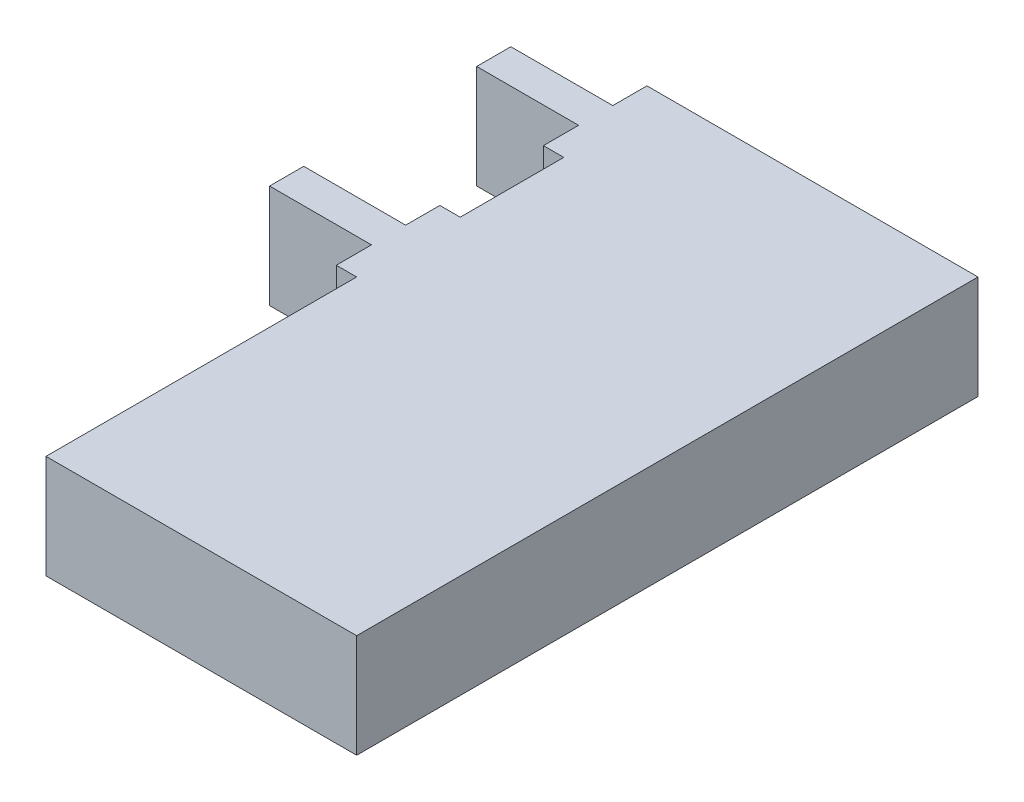
ISO-10303-21;
HEADER;
FILE_DESCRIPTION(('STEP AP214'),'2;1');
FILE_NAME('part.step','',(''),(''),'','','');
FILE_SCHEMA(('AUTOMOTIVE_DESIGN { 1 0 10303 214 1 1 1 1 }'));
ENDSEC;
DATA;
#1=APPLICATION_CONTEXT('core data for automotive mechanical design processes');
#2=APPLICATION_PROTOCOL_DEFINITION('international standard','automotive_design',2000,#1);
#3=PRODUCT_CONTEXT('',#1,'mechanical');
#4=PRODUCT('Part','Part','',(#3));
#5=PRODUCT_RELATED_PRODUCT_CATEGORY('part','',(#4));
#6=PRODUCT_DEFINITION_FORMATION('','',#4);
#7=PRODUCT_DEFINITION_CONTEXT('part definition',#1,'design');
#8=PRODUCT_DEFINITION('design','',#6,#7);
#9=PRODUCT_DEFINITION_SHAPE('','',#8);
#10=(LENGTH_UNIT() NAMED_UNIT(*) SI_UNIT(.MILLI.,.METRE.));
#11=(NAMED_UNIT(*) PLANE_ANGLE_UNIT() SI_UNIT($,.RADIAN.));
#12=(NAMED_UNIT(*) SI_UNIT($,.STERADIAN.) SOLID_ANGLE_UNIT());
#13=UNCERTAINTY_MEASURE_WITH_UNIT(LENGTH_MEASURE(1.E-05),#10,'distance_accuracy_value','');
#14=(GEOMETRIC_REPRESENTATION_CONTEXT(3) GLOBAL_UNCERTAINTY_ASSIGNED_CONTEXT((#13)) GLOBAL_UNIT_ASSIGNED_CONTEXT((#10,
#11,#12)) REPRESENTATION_CONTEXT('',''));
#15=CARTESIAN_POINT('',(0.,0.,0.));
#16=DIRECTION('',(0.,0.,1.));
#17=DIRECTION('',(1.,0.,0.));
#18=AXIS2_PLACEMENT_3D('',#15,#16,#17);
#19=CARTESIAN_POINT('',(-43.1,0.,-25.4));
#20=DIRECTION('',(-1.,0.,0.));
#21=DIRECTION('',(0.,0.,1.));
#22=AXIS2_PLACEMENT_3D('',#19,#20,#21);
#23=PLANE('',#22);
#24=DIRECTION('',(0.,0.,1.));
#25=VECTOR('',#24,1.);
#26=CARTESIAN_POINT('',(-43.1,0.,-25.4));
#27=LINE('',#26,#25);
#28=CARTESIAN_POINT('',(-43.1,0.,-25.4));
#29=VERTEX_POINT('',#28);
#30=CARTESIAN_POINT('',(-43.1,0.,-17.018));
#31=VERTEX_POINT('',#30);
#32=EDGE_CURVE('E195',#29,#31,#27,.T.);
#33=ORIENTED_EDGE('',*,*,#32,.T.);
#34=DIRECTION('',(0.,-1.,0.));
#35=VECTOR('',#34,1.);
#36=CARTESIAN_POINT('',(-43.1,25.4,-17.018));
#37=LINE('',#36,#35);
#38=CARTESIAN_POINT('',(-43.1,25.4,-17.018));
#39=VERTEX_POINT('',#38);
#40=EDGE_CURVE('E181',#39,#31,#37,.T.);
#41=ORIENTED_EDGE('',*,*,#40,.F.);
#42=DIRECTION('',(0.,0.,-1.));
#43=VECTOR('',#42,1.);
#44=CARTESIAN_POINT('',(-43.1,25.4,-25.4));
#45=LINE('',#44,#43);
#46=CARTESIAN_POINT('',(-43.1,25.4,-25.4));
#47=VERTEX_POINT('',#46);
#48=EDGE_CURVE('E199',#39,#47,#45,.T.);
#49=ORIENTED_EDGE('',*,*,#48,.T.);
#50=DIRECTION('',(0.,-1.,0.));
#51=VECTOR('',#50,1.);
#52=CARTESIAN_POINT('',(-43.1,25.4,-25.4));
#53=LINE('',#52,#51);
#54=EDGE_CURVE('E191',#47,#29,#53,.T.);
#55=ORIENTED_EDGE('',*,*,#54,.T.);
#56=EDGE_LOOP('',(#33,#41,#49,#55));
#57=FACE_BOUND('',#56,.T.);
#58=ADVANCED_FACE('F31',(#57),#23,.T.);
#59=CARTESIAN_POINT('',(-43.1,25.4,0.));
#60=VERTEX_POINT('',#59);
#61=CARTESIAN_POINT('',(-43.1,25.4,-8.636));
#62=VERTEX_POINT('',#61);
#63=EDGE_CURVE('E49',#60,#62,#45,.T.);
#64=ORIENTED_EDGE('',*,*,#63,.T.);
#65=DIRECTION('',(0.,1.,0.));
#66=VECTOR('',#65,1.);
#67=CARTESIAN_POINT('',(-43.1,25.4,-8.636));
#68=LINE('',#67,#66);
#69=CARTESIAN_POINT('',(-43.1,0.,-8.63599999999999));
#70=VERTEX_POINT('',#69);
#71=EDGE_CURVE('E53',#70,#62,#68,.T.);
#72=ORIENTED_EDGE('',*,*,#71,.F.);
#73=CARTESIAN_POINT('',(-43.1,0.,0.));
#74=VERTEX_POINT('',#73);
#75=EDGE_CURVE('E194',#70,#74,#27,.T.);
#76=ORIENTED_EDGE('',*,*,#75,.T.);
#77=DIRECTION('',(0.,1.,0.));
#78=VECTOR('',#77,1.);
#79=CARTESIAN_POINT('',(-43.1,25.4,0.));
#80=LINE('',#79,#78);
#81=EDGE_CURVE('E197',#74,#60,#80,.T.);
#82=ORIENTED_EDGE('',*,*,#81,.T.);
#83=EDGE_LOOP('',(#64,#72,#76,#82));
#84=FACE_BOUND('',#83,.T.);
#85=ADVANCED_FACE('F389',(#84),#23,.T.);
#86=CARTESIAN_POINT('',(-38.1,25.4,76.2));
#87=DIRECTION('',(1.,0.,0.));
#88=DIRECTION('',(0.,0.,-1.));
#89=AXIS2_PLACEMENT_3D('',#86,#87,#88);
#90=PLANE('',#89);
#91=DIRECTION('',(0.,-1.,0.));
#92=VECTOR('',#91,1.);
#93=CARTESIAN_POINT('',(-38.1,25.4,-25.4));
#94=LINE('',#93,#92);
#95=CARTESIAN_POINT('',(-38.1,25.4,-25.4));
#96=VERTEX_POINT('',#95);
#97=CARTESIAN_POINT('',(-38.1,0.,-25.4));
#98=VERTEX_POINT('',#97);
#99=EDGE_CURVE('E182',#96,#98,#94,.T.);
#100=ORIENTED_EDGE('',*,*,#99,.F.);
#101=DIRECTION('',(0.,0.,1.));
#102=VECTOR('',#101,1.);
#103=CARTESIAN_POINT('',(-38.1,25.4,76.2));
#104=LINE('',#103,#102);
#105=CARTESIAN_POINT('',(-38.1,25.4,-50.8));
#106=VERTEX_POINT('',#105);
#107=EDGE_CURVE('E255',#106,#96,#104,.T.);
#108=ORIENTED_EDGE('',*,*,#107,.F.);
#109=DIRECTION('',(0.,1.,0.));
#110=VECTOR('',#109,1.);
#111=CARTESIAN_POINT('',(-38.1,25.4,-50.8));
#112=LINE('',#111,#110);
#113=CARTESIAN_POINT('',(-38.1,0.,-50.7999999999999));
#114=VERTEX_POINT('',#113);
#115=EDGE_CURVE('E259',#114,#106,#112,.T.);
#116=ORIENTED_EDGE('',*,*,#115,.F.);
#117=DIRECTION('',(0.,0.,1.));
#118=VECTOR('',#117,1.);
#119=CARTESIAN_POINT('',(-38.1,0.,76.2));
#120=LINE('',#119,#118);
#121=EDGE_CURVE('E243',#114,#98,#120,.T.);
#122=ORIENTED_EDGE('',*,*,#121,.T.);
#123=EDGE_LOOP('',(#100,#108,#116,#122));
#124=FACE_BOUND('',#123,.T.);
#125=ADVANCED_FACE('F394',(#124),#90,.F.);
#126=DIRECTION('',(0.,1.,0.));
#127=VECTOR('',#126,1.);
#128=CARTESIAN_POINT('',(-38.1,25.4,0.));
#129=LINE('',#128,#127);
#130=CARTESIAN_POINT('',(-38.1,0.,0.));
#131=VERTEX_POINT('',#130);
#132=CARTESIAN_POINT('',(-38.1,25.4,0.));
#133=VERTEX_POINT('',#132);
#134=EDGE_CURVE('E185',#131,#133,#129,.T.);
#135=ORIENTED_EDGE('',*,*,#134,.F.);
#136=CARTESIAN_POINT('',(-38.1,0.,76.2));
#137=VERTEX_POINT('',#136);
#138=EDGE_CURVE('E241',#131,#137,#120,.T.);
#139=ORIENTED_EDGE('',*,*,#138,.T.);
#140=DIRECTION('',(0.,-1.,0.));
#141=VECTOR('',#140,1.);
#142=CARTESIAN_POINT('',(-38.1,25.4,76.2));
#143=LINE('',#142,#141);
#144=CARTESIAN_POINT('',(-38.1,25.4,76.2));
#145=VERTEX_POINT('',#144);
#146=EDGE_CURVE('E41',#145,#137,#143,.T.);
#147=ORIENTED_EDGE('',*,*,#146,.F.);
#148=EDGE_CURVE('E35',#133,#145,#104,.T.);
#149=ORIENTED_EDGE('',*,*,#148,.F.);
#150=EDGE_LOOP('',(#135,#139,#147,#149));
#151=FACE_BOUND('',#150,.T.);
#152=ADVANCED_FACE('F375',(#151),#90,.F.);
#153=CARTESIAN_POINT('',(-43.1,0.,-76.2));
#154=DIRECTION('',(-1.,0.,0.));
#155=DIRECTION('',(0.,0.,1.));
#156=AXIS2_PLACEMENT_3D('',#153,#154,#155);
#157=PLANE('',#156);
#158=DIRECTION('',(0.,-1.,0.));
#159=VECTOR('',#158,1.);
#160=CARTESIAN_POINT('',(-43.1,25.4,-67.818));
#161=LINE('',#160,#159);
#162=CARTESIAN_POINT('',(-43.1,25.4,-67.818));
#163=VERTEX_POINT('',#162);
#164=CARTESIAN_POINT('',(-43.1,0.,-67.818));
#165=VERTEX_POINT('',#164);
#166=EDGE_CURVE('E215',#163,#165,#161,.T.);
#167=ORIENTED_EDGE('',*,*,#166,.F.);
#168=DIRECTION('',(0.,0.,-1.));
#169=VECTOR('',#168,1.);
#170=CARTESIAN_POINT('',(-43.1,25.4,-76.2));
#171=LINE('',#170,#169);
#172=CARTESIAN_POINT('',(-43.1,25.4,-76.2));
#173=VERTEX_POINT('',#172);
#174=EDGE_CURVE('E300',#163,#173,#171,.T.);
#175=ORIENTED_EDGE('',*,*,#174,.T.);
#176=DIRECTION('',(0.,-1.,0.));
#177=VECTOR('',#176,1.);
#178=CARTESIAN_POINT('',(-43.1,25.4,-76.2));
#179=LINE('',#178,#177);
#180=CARTESIAN_POINT('',(-43.1,0.,-76.2));
#181=VERTEX_POINT('',#180);
#182=EDGE_CURVE('E297',#173,#181,#179,.T.);
#183=ORIENTED_EDGE('',*,*,#182,.T.);
#184=DIRECTION('',(0.,0.,1.));
#185=VECTOR('',#184,1.);
#186=CARTESIAN_POINT('',(-43.1,0.,-76.2));
#187=LINE('',#186,#185);
#188=EDGE_CURVE('E289',#181,#165,#187,.T.);
#189=ORIENTED_EDGE('',*,*,#188,.T.);
#190=EDGE_LOOP('',(#167,#175,#183,#189));
#191=FACE_BOUND('',#190,.T.);
#192=ADVANCED_FACE('F313',(#191),#157,.T.);
#193=CARTESIAN_POINT('',(38.1,25.4,76.2));
#194=DIRECTION('',(-1.,0.,0.));
#195=DIRECTION('',(0.,0.,1.));
#196=AXIS2_PLACEMENT_3D('',#193,#194,#195);
#197=PLANE('',#196);
#198=DIRECTION('',(0.,0.,-1.));
#199=VECTOR('',#198,1.);
#200=CARTESIAN_POINT('',(38.1,0.,76.2));
#201=LINE('',#200,#199);
#202=CARTESIAN_POINT('',(38.1,0.,76.2));
#203=VERTEX_POINT('',#202);
#204=CARTESIAN_POINT('',(38.1,0.,-76.2));
#205=VERTEX_POINT('',#204);
#206=EDGE_CURVE('E269',#203,#205,#201,.T.);
#207=ORIENTED_EDGE('',*,*,#206,.T.);
#208=DIRECTION('',(0.,-1.,0.));
#209=VECTOR('',#208,1.);
#210=CARTESIAN_POINT('',(38.1,25.4,-76.2));
#211=LINE('',#210,#209);
#212=CARTESIAN_POINT('',(38.1,25.4,-76.2));
#213=VERTEX_POINT('',#212);
#214=EDGE_CURVE('E11',#213,#205,#211,.T.);
#215=ORIENTED_EDGE('',*,*,#214,.F.);
#216=DIRECTION('',(0.,0.,-1.));
#217=VECTOR('',#216,1.);
#218=CARTESIAN_POINT('',(38.1,25.4,76.2));
#219=LINE('',#218,#217);
#220=CARTESIAN_POINT('',(38.1,25.4,76.2));
#221=VERTEX_POINT('',#220);
#222=EDGE_CURVE('E320',#221,#213,#219,.T.);
#223=ORIENTED_EDGE('',*,*,#222,.F.);
#224=DIRECTION('',(0.,-1.,0.));
#225=VECTOR('',#224,1.);
#226=CARTESIAN_POINT('',(38.1,25.4,76.2));
#227=LINE('',#226,#225);
#228=EDGE_CURVE('E268',#221,#203,#227,.T.);
#229=ORIENTED_EDGE('',*,*,#228,.T.);
#230=EDGE_LOOP('',(#207,#215,#223,#229));
#231=FACE_BOUND('',#230,.T.);
#232=ADVANCED_FACE('F33',(#231),#197,.F.);
#233=CARTESIAN_POINT('',(-38.1,25.4,-76.2));
#234=DIRECTION('',(0.,0.,1.));
#235=DIRECTION('',(1.,0.,0.));
#236=AXIS2_PLACEMENT_3D('',#233,#234,#235);
#237=PLANE('',#236);
#238=DIRECTION('',(-1.,0.,0.));
#239=VECTOR('',#238,1.);
#240=CARTESIAN_POINT('',(-38.1,0.,-76.2));
#241=LINE('',#240,#239);
#242=EDGE_CURVE('E244',#205,#181,#241,.T.);
#243=ORIENTED_EDGE('',*,*,#242,.T.);
#244=ORIENTED_EDGE('',*,*,#182,.F.);
#245=DIRECTION('',(-1.,0.,0.));
#246=VECTOR('',#245,1.);
#247=CARTESIAN_POINT('',(-38.1,25.4,-76.2));
#248=LINE('',#247,#246);
#249=EDGE_CURVE('E265',#213,#173,#248,.T.);
#250=ORIENTED_EDGE('',*,*,#249,.F.);
#251=ORIENTED_EDGE('',*,*,#214,.T.);
#252=EDGE_LOOP('',(#243,#244,#250,#251));
#253=FACE_BOUND('',#252,.T.);
#254=ADVANCED_FACE('F322',(#253),#237,.F.);
#255=CARTESIAN_POINT('',(-38.1,25.4,76.2));
#256=DIRECTION('',(0.,0.,-1.));
#257=DIRECTION('',(-1.,0.,0.));
#258=AXIS2_PLACEMENT_3D('',#255,#256,#257);
#259=PLANE('',#258);
#260=DIRECTION('',(1.,0.,0.));
#261=VECTOR('',#260,1.);
#262=CARTESIAN_POINT('',(-38.1,0.,76.2));
#263=LINE('',#262,#261);
#264=EDGE_CURVE('E249',#137,#203,#263,.T.);
#265=ORIENTED_EDGE('',*,*,#264,.T.);
#266=ORIENTED_EDGE('',*,*,#228,.F.);
#267=DIRECTION('',(1.,0.,0.));
#268=VECTOR('',#267,1.);
#269=CARTESIAN_POINT('',(-38.1,25.4,76.2));
#270=LINE('',#269,#268);
#271=EDGE_CURVE('E258',#145,#221,#270,.T.);
#272=ORIENTED_EDGE('',*,*,#271,.F.);
#273=ORIENTED_EDGE('',*,*,#146,.T.);
#274=EDGE_LOOP('',(#265,#266,#272,#273));
#275=FACE_BOUND('',#274,.T.);
#276=ADVANCED_FACE('F381',(#275),#259,.F.);
#277=CARTESIAN_POINT('',(38.1,25.4,-76.2));
#278=DIRECTION('',(0.,-1.,0.));
#279=DIRECTION('',(0.,0.,-1.));
#280=AXIS2_PLACEMENT_3D('',#277,#278,#279);
#281=PLANE('',#280);
#282=ORIENTED_EDGE('',*,*,#222,.T.);
#283=ORIENTED_EDGE('',*,*,#249,.T.);
#284=ORIENTED_EDGE('',*,*,#174,.F.);
#285=DIRECTION('',(1.,0.,0.));
#286=VECTOR('',#285,1.);
#287=CARTESIAN_POINT('',(-68.1,25.4,-67.818));
#288=LINE('',#287,#286);
#289=CARTESIAN_POINT('',(-68.1,25.4,-67.818));
#290=VERTEX_POINT('',#289);
#291=EDGE_CURVE('E226',#290,#163,#288,.T.);
#292=ORIENTED_EDGE('',*,*,#291,.F.);
#293=DIRECTION('',(0.,0.,-1.));
#294=VECTOR('',#293,1.);
#295=CARTESIAN_POINT('',(-68.1,25.4,-67.818));
#296=LINE('',#295,#294);
#297=CARTESIAN_POINT('',(-68.1,25.4,-59.436));
#298=VERTEX_POINT('',#297);
#299=EDGE_CURVE('E224',#298,#290,#296,.T.);
#300=ORIENTED_EDGE('',*,*,#299,.F.);
#301=DIRECTION('',(1.,0.,0.));
#302=VECTOR('',#301,1.);
#303=CARTESIAN_POINT('',(-68.1,25.4,-59.436));
#304=LINE('',#303,#302);
#305=CARTESIAN_POINT('',(-43.1,25.4,-59.436));
#306=VERTEX_POINT('',#305);
#307=EDGE_CURVE('E239',#298,#306,#304,.T.);
#308=ORIENTED_EDGE('',*,*,#307,.T.);
#309=CARTESIAN_POINT('',(-43.1,25.4,-50.8));
#310=VERTEX_POINT('',#309);
#311=EDGE_CURVE('E283',#310,#306,#171,.T.);
#312=ORIENTED_EDGE('',*,*,#311,.F.);
#313=DIRECTION('',(1.,0.,0.));
#314=VECTOR('',#313,1.);
#315=CARTESIAN_POINT('',(-43.1,25.4,-50.8));
#316=LINE('',#315,#314);
#317=EDGE_CURVE('E276',#310,#106,#316,.T.);
#318=ORIENTED_EDGE('',*,*,#317,.T.);
#319=ORIENTED_EDGE('',*,*,#107,.T.);
#320=DIRECTION('',(1.,0.,0.));
#321=VECTOR('',#320,1.);
#322=CARTESIAN_POINT('',(-43.1,25.4,-25.4));
#323=LINE('',#322,#321);
#324=EDGE_CURVE('E200',#47,#96,#323,.T.);
#325=ORIENTED_EDGE('',*,*,#324,.F.);
#326=ORIENTED_EDGE('',*,*,#48,.F.);
#327=DIRECTION('',(1.,0.,0.));
#328=VECTOR('',#327,1.);
#329=CARTESIAN_POINT('',(-68.1,25.4,-17.018));
#330=LINE('',#329,#328);
#331=CARTESIAN_POINT('',(-68.1,25.4,-17.018));
#332=VERTEX_POINT('',#331);
#333=EDGE_CURVE('E357',#332,#39,#330,.T.);
#334=ORIENTED_EDGE('',*,*,#333,.F.);
#335=DIRECTION('',(0.,0.,-1.));
#336=VECTOR('',#335,1.);
#337=CARTESIAN_POINT('',(-68.1,25.4,-17.018));
#338=LINE('',#337,#336);
#339=CARTESIAN_POINT('',(-68.1,25.4,-8.636));
#340=VERTEX_POINT('',#339);
#341=EDGE_CURVE('E174',#340,#332,#338,.T.);
#342=ORIENTED_EDGE('',*,*,#341,.F.);
#343=DIRECTION('',(1.,0.,0.));
#344=VECTOR('',#343,1.);
#345=CARTESIAN_POINT('',(-68.1,25.4,-8.636));
#346=LINE('',#345,#344);
#347=EDGE_CURVE('E187',#340,#62,#346,.T.);
#348=ORIENTED_EDGE('',*,*,#347,.T.);
#349=ORIENTED_EDGE('',*,*,#63,.F.);
#350=DIRECTION('',(1.,0.,0.));
#351=VECTOR('',#350,1.);
#352=CARTESIAN_POINT('',(-43.1,25.4,0.));
#353=LINE('',#352,#351);
#354=EDGE_CURVE('E206',#60,#133,#353,.T.);
#355=ORIENTED_EDGE('',*,*,#354,.T.);
#356=ORIENTED_EDGE('',*,*,#148,.T.);
#357=ORIENTED_EDGE('',*,*,#271,.T.);
#358=EDGE_LOOP('',(#282,#283,#284,#292,#300,#308,#312,#318,#319,#325,#326,#334,#342,#348,#349,
#355,#356,#357));
#359=FACE_BOUND('',#358,.T.);
#360=ADVANCED_FACE('F318',(#359),#281,.F.);
#361=CARTESIAN_POINT('',(38.1,0.,-76.2));
#362=DIRECTION('',(0.,-1.,0.));
#363=DIRECTION('',(0.,0.,-1.));
#364=AXIS2_PLACEMENT_3D('',#361,#362,#363);
#365=PLANE('',#364);
#366=ORIENTED_EDGE('',*,*,#206,.F.);
#367=ORIENTED_EDGE('',*,*,#264,.F.);
#368=ORIENTED_EDGE('',*,*,#138,.F.);
#369=DIRECTION('',(1.,0.,0.));
#370=VECTOR('',#369,1.);
#371=CARTESIAN_POINT('',(-43.1,0.,0.));
#372=LINE('',#371,#370);
#373=EDGE_CURVE('E209',#74,#131,#372,.T.);
#374=ORIENTED_EDGE('',*,*,#373,.F.);
#375=ORIENTED_EDGE('',*,*,#75,.F.);
#376=DIRECTION('',(1.,0.,0.));
#377=VECTOR('',#376,1.);
#378=CARTESIAN_POINT('',(-68.1,0.,-8.63599999999999));
#379=LINE('',#378,#377);
#380=CARTESIAN_POINT('',(-68.1,0.,-8.63599999999999));
#381=VERTEX_POINT('',#380);
#382=EDGE_CURVE('E165',#381,#70,#379,.T.);
#383=ORIENTED_EDGE('',*,*,#382,.F.);
#384=DIRECTION('',(0.,0.,1.));
#385=VECTOR('',#384,1.);
#386=CARTESIAN_POINT('',(-68.1,0.,-17.018));
#387=LINE('',#386,#385);
#388=CARTESIAN_POINT('',(-68.1,0.,-17.018));
#389=VERTEX_POINT('',#388);
#390=EDGE_CURVE('E157',#389,#381,#387,.T.);
#391=ORIENTED_EDGE('',*,*,#390,.F.);
#392=DIRECTION('',(1.,0.,0.));
#393=VECTOR('',#392,1.);
#394=CARTESIAN_POINT('',(-68.1,0.,-17.018));
#395=LINE('',#394,#393);
#396=EDGE_CURVE('E162',#389,#31,#395,.T.);
#397=ORIENTED_EDGE('',*,*,#396,.T.);
#398=ORIENTED_EDGE('',*,*,#32,.F.);
#399=DIRECTION('',(1.,0.,0.));
#400=VECTOR('',#399,1.);
#401=CARTESIAN_POINT('',(-43.1,0.,-25.4));
#402=LINE('',#401,#400);
#403=EDGE_CURVE('E212',#29,#98,#402,.T.);
#404=ORIENTED_EDGE('',*,*,#403,.T.);
#405=ORIENTED_EDGE('',*,*,#121,.F.);
#406=DIRECTION('',(1.,0.,0.));
#407=VECTOR('',#406,1.);
#408=CARTESIAN_POINT('',(-43.1,0.,-50.8));
#409=LINE('',#408,#407);
#410=CARTESIAN_POINT('',(-43.1,0.,-50.8));
#411=VERTEX_POINT('',#410);
#412=EDGE_CURVE('E271',#411,#114,#409,.T.);
#413=ORIENTED_EDGE('',*,*,#412,.F.);
#414=CARTESIAN_POINT('',(-43.1,0.,-59.436));
#415=VERTEX_POINT('',#414);
#416=EDGE_CURVE('E293',#415,#411,#187,.T.);
#417=ORIENTED_EDGE('',*,*,#416,.F.);
#418=DIRECTION('',(1.,0.,0.));
#419=VECTOR('',#418,1.);
#420=CARTESIAN_POINT('',(-68.1,0.,-59.436));
#421=LINE('',#420,#419);
#422=CARTESIAN_POINT('',(-68.1,0.,-59.436));
#423=VERTEX_POINT('',#422);
#424=EDGE_CURVE('E327',#423,#415,#421,.T.);
#425=ORIENTED_EDGE('',*,*,#424,.F.);
#426=DIRECTION('',(0.,0.,1.));
#427=VECTOR('',#426,1.);
#428=CARTESIAN_POINT('',(-68.1,0.,-67.818));
#429=LINE('',#428,#427);
#430=CARTESIAN_POINT('',(-68.1,0.,-67.818));
#431=VERTEX_POINT('',#430);
#432=EDGE_CURVE('E219',#431,#423,#429,.T.);
#433=ORIENTED_EDGE('',*,*,#432,.F.);
#434=DIRECTION('',(1.,0.,0.));
#435=VECTOR('',#434,1.);
#436=CARTESIAN_POINT('',(-68.1,0.,-67.818));
#437=LINE('',#436,#435);
#438=EDGE_CURVE('E324',#431,#165,#437,.T.);
#439=ORIENTED_EDGE('',*,*,#438,.T.);
#440=ORIENTED_EDGE('',*,*,#188,.F.);
#441=ORIENTED_EDGE('',*,*,#242,.F.);
#442=EDGE_LOOP('',(#366,#367,#368,#374,#375,#383,#391,#397,#398,#404,#405,#413,#417,#425,#433,
#439,#440,#441));
#443=FACE_BOUND('',#442,.T.);
#444=ADVANCED_FACE('F160',(#443),#365,.T.);
#445=CARTESIAN_POINT('',(-43.1,25.4,-50.8));
#446=DIRECTION('',(0.,0.,-1.));
#447=DIRECTION('',(0.,1.,0.));
#448=AXIS2_PLACEMENT_3D('',#445,#446,#447);
#449=PLANE('',#448);
#450=ORIENTED_EDGE('',*,*,#115,.T.);
#451=ORIENTED_EDGE('',*,*,#317,.F.);
#452=DIRECTION('',(0.,1.,0.));
#453=VECTOR('',#452,1.);
#454=CARTESIAN_POINT('',(-43.1,25.4,-50.8));
#455=LINE('',#454,#453);
#456=EDGE_CURVE('E292',#411,#310,#455,.T.);
#457=ORIENTED_EDGE('',*,*,#456,.F.);
#458=ORIENTED_EDGE('',*,*,#412,.T.);
#459=EDGE_LOOP('',(#450,#451,#457,#458));
#460=FACE_BOUND('',#459,.T.);
#461=ADVANCED_FACE('F349',(#460),#449,.F.);
#462=DIRECTION('',(0.,1.,0.));
#463=VECTOR('',#462,1.);
#464=CARTESIAN_POINT('',(-43.1,25.4,-59.436));
#465=LINE('',#464,#463);
#466=EDGE_CURVE('E220',#415,#306,#465,.T.);
#467=ORIENTED_EDGE('',*,*,#466,.F.);
#468=ORIENTED_EDGE('',*,*,#416,.T.);
#469=ORIENTED_EDGE('',*,*,#456,.T.);
#470=ORIENTED_EDGE('',*,*,#311,.T.);
#471=EDGE_LOOP('',(#467,#468,#469,#470));
#472=FACE_BOUND('',#471,.T.);
#473=ADVANCED_FACE('F348',(#472),#157,.T.);
#474=CARTESIAN_POINT('',(-68.1,25.4,-67.818));
#475=DIRECTION('',(0.,0.,1.));
#476=DIRECTION('',(1.,0.,0.));
#477=AXIS2_PLACEMENT_3D('',#474,#475,#476);
#478=PLANE('',#477);
#479=ORIENTED_EDGE('',*,*,#166,.T.);
#480=ORIENTED_EDGE('',*,*,#438,.F.);
#481=DIRECTION('',(0.,-1.,0.));
#482=VECTOR('',#481,1.);
#483=CARTESIAN_POINT('',(-68.1,25.4,-67.818));
#484=LINE('',#483,#482);
#485=EDGE_CURVE('E216',#290,#431,#484,.T.);
#486=ORIENTED_EDGE('',*,*,#485,.F.);
#487=ORIENTED_EDGE('',*,*,#291,.T.);
#488=EDGE_LOOP('',(#479,#480,#486,#487));
#489=FACE_BOUND('',#488,.T.);
#490=ADVANCED_FACE('F406',(#489),#478,.F.);
#491=CARTESIAN_POINT('',(-68.1,25.4,-59.436));
#492=DIRECTION('',(0.,0.,-1.));
#493=DIRECTION('',(-1.,0.,0.));
#494=AXIS2_PLACEMENT_3D('',#491,#492,#493);
#495=PLANE('',#494);
#496=ORIENTED_EDGE('',*,*,#466,.T.);
#497=ORIENTED_EDGE('',*,*,#307,.F.);
#498=DIRECTION('',(0.,1.,0.));
#499=VECTOR('',#498,1.);
#500=CARTESIAN_POINT('',(-68.1,25.4,-59.436));
#501=LINE('',#500,#499);
#502=EDGE_CURVE('E222',#423,#298,#501,.T.);
#503=ORIENTED_EDGE('',*,*,#502,.F.);
#504=ORIENTED_EDGE('',*,*,#424,.T.);
#505=EDGE_LOOP('',(#496,#497,#503,#504));
#506=FACE_BOUND('',#505,.T.);
#507=ADVANCED_FACE('F339',(#506),#495,.F.);
#508=CARTESIAN_POINT('',(-68.1,0.,-67.818));
#509=DIRECTION('',(-1.,0.,0.));
#510=DIRECTION('',(0.,0.,1.));
#511=AXIS2_PLACEMENT_3D('',#508,#509,#510);
#512=PLANE('',#511);
#513=ORIENTED_EDGE('',*,*,#485,.T.);
#514=ORIENTED_EDGE('',*,*,#432,.T.);
#515=ORIENTED_EDGE('',*,*,#502,.T.);
#516=ORIENTED_EDGE('',*,*,#299,.T.);
#517=EDGE_LOOP('',(#513,#514,#515,#516));
#518=FACE_BOUND('',#517,.T.);
#519=ADVANCED_FACE('F346',(#518),#512,.T.);
#520=CARTESIAN_POINT('',(-43.1,25.4,-25.4));
#521=DIRECTION('',(0.,0.,1.));
#522=DIRECTION('',(0.,-1.,0.));
#523=AXIS2_PLACEMENT_3D('',#520,#521,#522);
#524=PLANE('',#523);
#525=ORIENTED_EDGE('',*,*,#99,.T.);
#526=ORIENTED_EDGE('',*,*,#403,.F.);
#527=ORIENTED_EDGE('',*,*,#54,.F.);
#528=ORIENTED_EDGE('',*,*,#324,.T.);
#529=EDGE_LOOP('',(#525,#526,#527,#528));
#530=FACE_BOUND('',#529,.T.);
#531=ADVANCED_FACE('F354',(#530),#524,.F.);
#532=CARTESIAN_POINT('',(-43.1,25.4,0.));
#533=DIRECTION('',(0.,0.,-1.));
#534=DIRECTION('',(-1.,0.,0.));
#535=AXIS2_PLACEMENT_3D('',#532,#533,#534);
#536=PLANE('',#535);
#537=ORIENTED_EDGE('',*,*,#134,.T.);
#538=ORIENTED_EDGE('',*,*,#354,.F.);
#539=ORIENTED_EDGE('',*,*,#81,.F.);
#540=ORIENTED_EDGE('',*,*,#373,.T.);
#541=EDGE_LOOP('',(#537,#538,#539,#540));
#542=FACE_BOUND('',#541,.T.);
#543=ADVANCED_FACE('F371',(#542),#536,.F.);
#544=CARTESIAN_POINT('',(-68.1,25.4,-17.018));
#545=DIRECTION('',(0.,0.,1.));
#546=DIRECTION('',(0.,-1.,0.));
#547=AXIS2_PLACEMENT_3D('',#544,#545,#546);
#548=PLANE('',#547);
#549=ORIENTED_EDGE('',*,*,#40,.T.);
#550=ORIENTED_EDGE('',*,*,#396,.F.);
#551=DIRECTION('',(0.,-1.,0.));
#552=VECTOR('',#551,1.);
#553=CARTESIAN_POINT('',(-68.1,25.4,-17.018));
#554=LINE('',#553,#552);
#555=EDGE_CURVE('E169',#332,#389,#554,.T.);
#556=ORIENTED_EDGE('',*,*,#555,.F.);
#557=ORIENTED_EDGE('',*,*,#333,.T.);
#558=EDGE_LOOP('',(#549,#550,#556,#557));
#559=FACE_BOUND('',#558,.T.);
#560=ADVANCED_FACE('F179',(#559),#548,.F.);
#561=CARTESIAN_POINT('',(-68.1,25.4,-8.636));
#562=DIRECTION('',(0.,0.,-1.));
#563=DIRECTION('',(0.,1.,0.));
#564=AXIS2_PLACEMENT_3D('',#561,#562,#563);
#565=PLANE('',#564);
#566=ORIENTED_EDGE('',*,*,#71,.T.);
#567=ORIENTED_EDGE('',*,*,#347,.F.);
#568=DIRECTION('',(0.,1.,0.));
#569=VECTOR('',#568,1.);
#570=CARTESIAN_POINT('',(-68.1,25.4,-8.636));
#571=LINE('',#570,#569);
#572=EDGE_CURVE('E168',#381,#340,#571,.T.);
#573=ORIENTED_EDGE('',*,*,#572,.F.);
#574=ORIENTED_EDGE('',*,*,#382,.T.);
#575=EDGE_LOOP('',(#566,#567,#573,#574));
#576=FACE_BOUND('',#575,.T.);
#577=ADVANCED_FACE('F366',(#576),#565,.F.);
#578=CARTESIAN_POINT('',(-68.1,0.,-17.018));
#579=DIRECTION('',(-1.,0.,0.));
#580=DIRECTION('',(0.,0.,1.));
#581=AXIS2_PLACEMENT_3D('',#578,#579,#580);
#582=PLANE('',#581);
#583=ORIENTED_EDGE('',*,*,#555,.T.);
#584=ORIENTED_EDGE('',*,*,#390,.T.);
#585=ORIENTED_EDGE('',*,*,#572,.T.);
#586=ORIENTED_EDGE('',*,*,#341,.T.);
#587=EDGE_LOOP('',(#583,#584,#585,#586));
#588=FACE_BOUND('',#587,.T.);
#589=ADVANCED_FACE('F172',(#588),#582,.T.);
#590=CLOSED_SHELL('',(#58,#85,#125,#152,#192,#232,#254,#276,#360,#444,#461,#473,#490,#507,#519,
#531,#543,#560,#577,#589));
#591=MANIFOLD_SOLID_BREP('B2',#590);
#592=ADVANCED_BREP_SHAPE_REPRESENTATION('',(#18,#591),#14);
#593=SHAPE_DEFINITION_REPRESENTATION(#9,#592);
ENDSEC;
END-ISO-10303-21;
